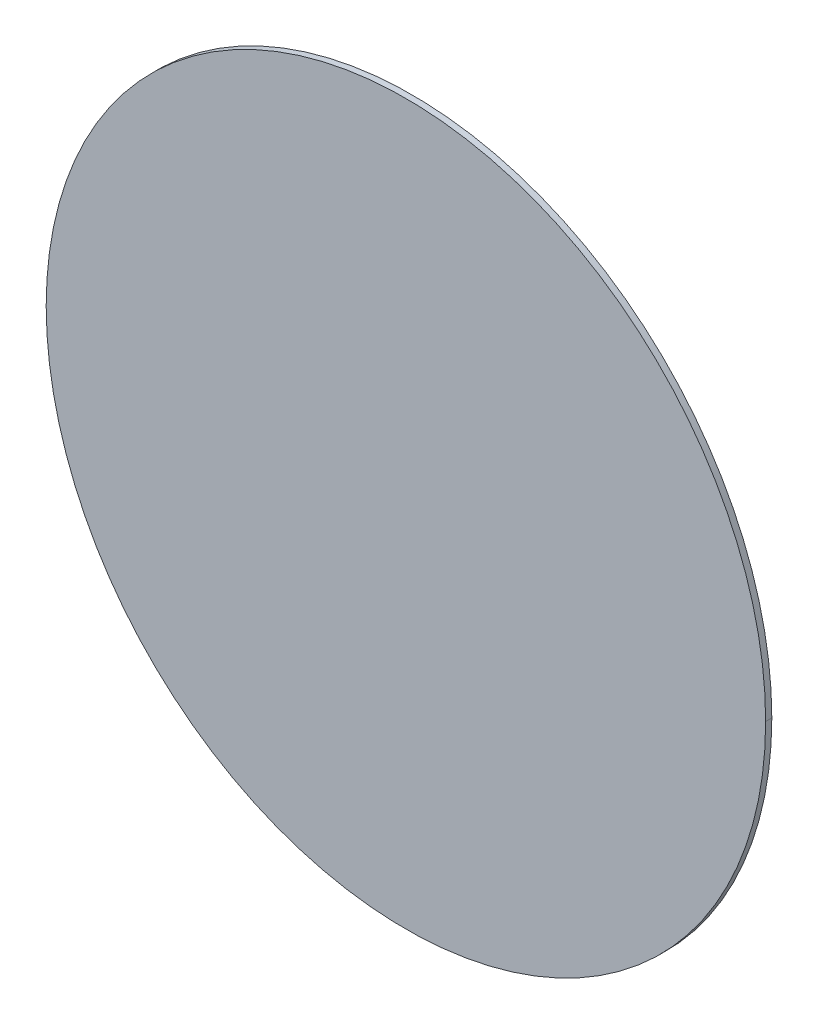
ISO-10303-21;
HEADER;
FILE_DESCRIPTION(('STEP AP214'),'2;1');
FILE_NAME('part.step','',(''),(''),'','','');
FILE_SCHEMA(('AUTOMOTIVE_DESIGN { 1 0 10303 214 1 1 1 1 }'));
ENDSEC;
DATA;
#1=APPLICATION_CONTEXT('core data for automotive mechanical design processes');
#2=APPLICATION_PROTOCOL_DEFINITION('international standard','automotive_design',2000,#1);
#3=PRODUCT_CONTEXT('',#1,'mechanical');
#4=PRODUCT('Part','Part','',(#3));
#5=PRODUCT_RELATED_PRODUCT_CATEGORY('part','',(#4));
#6=PRODUCT_DEFINITION_FORMATION('','',#4);
#7=PRODUCT_DEFINITION_CONTEXT('part definition',#1,'design');
#8=PRODUCT_DEFINITION('design','',#6,#7);
#9=PRODUCT_DEFINITION_SHAPE('','',#8);
#10=(LENGTH_UNIT() NAMED_UNIT(*) SI_UNIT(.MILLI.,.METRE.));
#11=(NAMED_UNIT(*) PLANE_ANGLE_UNIT() SI_UNIT($,.RADIAN.));
#12=(NAMED_UNIT(*) SI_UNIT($,.STERADIAN.) SOLID_ANGLE_UNIT());
#13=UNCERTAINTY_MEASURE_WITH_UNIT(LENGTH_MEASURE(1.E-05),#10,'distance_accuracy_value','');
#14=(GEOMETRIC_REPRESENTATION_CONTEXT(3) GLOBAL_UNCERTAINTY_ASSIGNED_CONTEXT((#13)) GLOBAL_UNIT_ASSIGNED_CONTEXT((#10,
#11,#12)) REPRESENTATION_CONTEXT('',''));
#15=CARTESIAN_POINT('',(0.,0.,0.));
#16=DIRECTION('',(0.,0.,1.));
#17=DIRECTION('',(1.,0.,0.));
#18=AXIS2_PLACEMENT_3D('',#15,#16,#17);
#19=CARTESIAN_POINT('',(44.23,52.74,2.546800003052));
#20=DIRECTION('',(0.,0.,1.));
#21=DIRECTION('',(1.,0.,0.));
#22=AXIS2_PLACEMENT_3D('',#19,#20,#21);
#23=PLANE('',#22);
#24=CARTESIAN_POINT('',(44.23,52.74,2.546800003052));
#25=DIRECTION('',(0.,0.,-1.));
#26=DIRECTION('',(-1.,0.,0.));
#27=AXIS2_PLACEMENT_3D('',#24,#25,#26);
#28=CIRCLE('',#27,0.1749999675);
#29=CARTESIAN_POINT('',(44.0550000325,52.74,2.546800003052));
#30=VERTEX_POINT('',#29);
#31=CARTESIAN_POINT('',(44.4049999675,52.74,2.546800003052));
#32=VERTEX_POINT('',#31);
#33=EDGE_CURVE('E62',#30,#32,#28,.T.);
#34=ORIENTED_EDGE('',*,*,#33,.F.);
#35=CARTESIAN_POINT('',(44.23,52.74,2.546800003052));
#36=DIRECTION('',(0.,0.,-1.));
#37=DIRECTION('',(-1.,0.,0.));
#38=AXIS2_PLACEMENT_3D('',#35,#36,#37);
#39=CIRCLE('',#38,0.1749999675);
#40=EDGE_CURVE('E11',#32,#30,#39,.T.);
#41=ORIENTED_EDGE('',*,*,#40,.F.);
#42=EDGE_LOOP('',(#34,#41));
#43=FACE_BOUND('',#42,.T.);
#44=ADVANCED_FACE('F17',(#43),#23,.T.);
#45=CARTESIAN_POINT('',(44.23,52.74,2.543800003052));
#46=DIRECTION('',(0.,0.,-1.));
#47=DIRECTION('',(-1.,0.,0.));
#48=AXIS2_PLACEMENT_3D('',#45,#46,#47);
#49=CYLINDRICAL_SURFACE('',#48,0.1749999675);
#50=DIRECTION('',(0.,0.,-1.));
#51=VECTOR('',#50,1.);
#52=CARTESIAN_POINT('',(44.4049999675,52.74,2.543800003052));
#53=LINE('',#52,#51);
#54=CARTESIAN_POINT('',(44.4049999675,52.74,2.543800003052));
#55=VERTEX_POINT('',#54);
#56=EDGE_CURVE('E56',#32,#55,#53,.T.);
#57=ORIENTED_EDGE('',*,*,#56,.F.);
#58=ORIENTED_EDGE('',*,*,#40,.T.);
#59=DIRECTION('',(0.,0.,-1.));
#60=VECTOR('',#59,1.);
#61=CARTESIAN_POINT('',(44.0550000325,52.74,2.543800003052));
#62=LINE('',#61,#60);
#63=CARTESIAN_POINT('',(44.0550000325,52.74,2.543800003052));
#64=VERTEX_POINT('',#63);
#65=EDGE_CURVE('E53',#30,#64,#62,.T.);
#66=ORIENTED_EDGE('',*,*,#65,.T.);
#67=CARTESIAN_POINT('',(44.23,52.74,2.543800003052));
#68=DIRECTION('',(0.,0.,1.));
#69=DIRECTION('',(-1.,0.,0.));
#70=AXIS2_PLACEMENT_3D('',#67,#68,#69);
#71=CIRCLE('',#70,0.1749999675);
#72=EDGE_CURVE('E27',#64,#55,#71,.T.);
#73=ORIENTED_EDGE('',*,*,#72,.T.);
#74=EDGE_LOOP('',(#57,#58,#66,#73));
#75=FACE_BOUND('',#74,.T.);
#76=ADVANCED_FACE('F52',(#75),#49,.T.);
#77=CARTESIAN_POINT('',(44.23,52.74,2.543800003052));
#78=DIRECTION('',(0.,0.,1.));
#79=DIRECTION('',(1.,0.,0.));
#80=AXIS2_PLACEMENT_3D('',#77,#78,#79);
#81=PLANE('',#80);
#82=ORIENTED_EDGE('',*,*,#72,.F.);
#83=CARTESIAN_POINT('',(44.23,52.74,2.543800003052));
#84=DIRECTION('',(0.,0.,1.));
#85=DIRECTION('',(-1.,0.,0.));
#86=AXIS2_PLACEMENT_3D('',#83,#84,#85);
#87=CIRCLE('',#86,0.1749999675);
#88=EDGE_CURVE('E21',#55,#64,#87,.T.);
#89=ORIENTED_EDGE('',*,*,#88,.F.);
#90=EDGE_LOOP('',(#82,#89));
#91=FACE_BOUND('',#90,.T.);
#92=ADVANCED_FACE('F19',(#91),#81,.F.);
#93=CARTESIAN_POINT('',(44.23,52.74,2.543800003052));
#94=DIRECTION('',(0.,0.,-1.));
#95=DIRECTION('',(-1.,0.,0.));
#96=AXIS2_PLACEMENT_3D('',#93,#94,#95);
#97=CYLINDRICAL_SURFACE('',#96,0.1749999675);
#98=ORIENTED_EDGE('',*,*,#33,.T.);
#99=ORIENTED_EDGE('',*,*,#56,.T.);
#100=ORIENTED_EDGE('',*,*,#88,.T.);
#101=ORIENTED_EDGE('',*,*,#65,.F.);
#102=EDGE_LOOP('',(#98,#99,#100,#101));
#103=FACE_BOUND('',#102,.T.);
#104=ADVANCED_FACE('F61',(#103),#97,.T.);
#105=CLOSED_SHELL('',(#44,#76,#92,#104));
#106=MANIFOLD_SOLID_BREP('B1',#105);
#107=ADVANCED_BREP_SHAPE_REPRESENTATION('',(#18,#106),#14);
#108=SHAPE_DEFINITION_REPRESENTATION(#9,#107);
ENDSEC;
END-ISO-10303-21;
